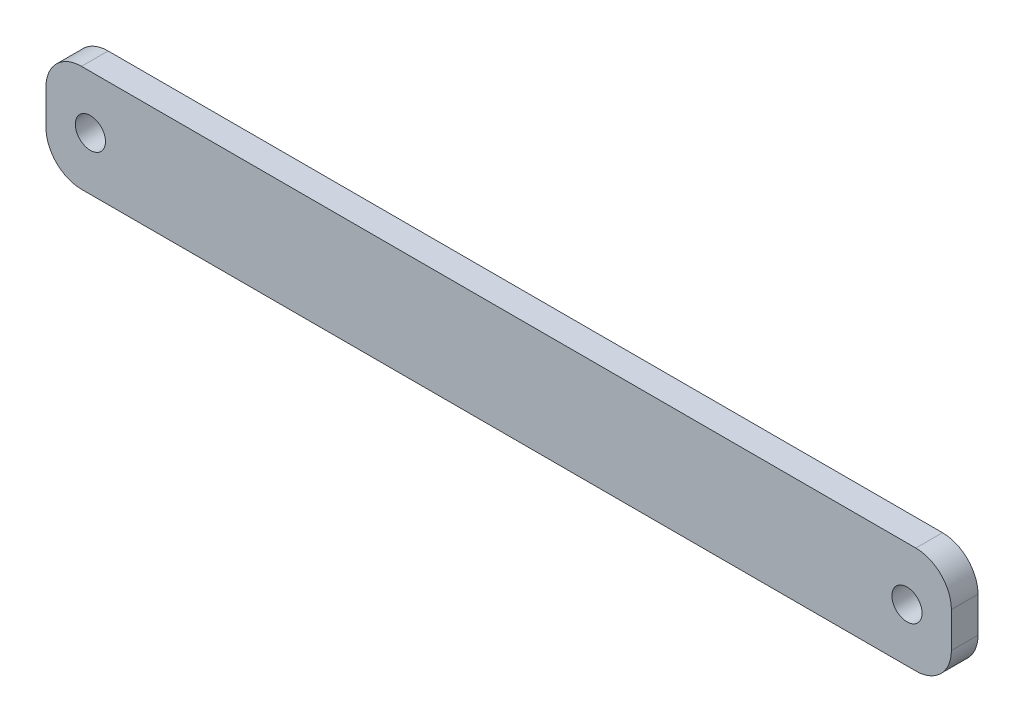
ISO-10303-21;
HEADER;
FILE_DESCRIPTION(('STEP AP214'),'2;1');
FILE_NAME('part.step','',(''),(''),'','','');
FILE_SCHEMA(('AUTOMOTIVE_DESIGN { 1 0 10303 214 1 1 1 1 }'));
ENDSEC;
DATA;
#1=APPLICATION_CONTEXT('core data for automotive mechanical design processes');
#2=APPLICATION_PROTOCOL_DEFINITION('international standard','automotive_design',2000,#1);
#3=PRODUCT_CONTEXT('',#1,'mechanical');
#4=PRODUCT('Part','Part','',(#3));
#5=PRODUCT_RELATED_PRODUCT_CATEGORY('part','',(#4));
#6=PRODUCT_DEFINITION_FORMATION('','',#4);
#7=PRODUCT_DEFINITION_CONTEXT('part definition',#1,'design');
#8=PRODUCT_DEFINITION('design','',#6,#7);
#9=PRODUCT_DEFINITION_SHAPE('','',#8);
#10=(LENGTH_UNIT() NAMED_UNIT(*) SI_UNIT(.MILLI.,.METRE.));
#11=(NAMED_UNIT(*) PLANE_ANGLE_UNIT() SI_UNIT($,.RADIAN.));
#12=(NAMED_UNIT(*) SI_UNIT($,.STERADIAN.) SOLID_ANGLE_UNIT());
#13=UNCERTAINTY_MEASURE_WITH_UNIT(LENGTH_MEASURE(1.E-05),#10,'distance_accuracy_value','');
#14=(GEOMETRIC_REPRESENTATION_CONTEXT(3) GLOBAL_UNCERTAINTY_ASSIGNED_CONTEXT((#13)) GLOBAL_UNIT_ASSIGNED_CONTEXT((#10,
#11,#12)) REPRESENTATION_CONTEXT('',''));
#15=CARTESIAN_POINT('',(0.,0.,0.));
#16=DIRECTION('',(0.,0.,1.));
#17=DIRECTION('',(1.,0.,0.));
#18=AXIS2_PLACEMENT_3D('',#15,#16,#17);
#19=CARTESIAN_POINT('',(-47.,-2.,3.));
#20=DIRECTION('',(0.,0.,-1.));
#21=DIRECTION('',(-1.,0.,0.));
#22=AXIS2_PLACEMENT_3D('',#19,#20,#21);
#23=CYLINDRICAL_SURFACE('',#22,4.);
#24=CARTESIAN_POINT('',(-47.,-2.,0.));
#25=DIRECTION('',(0.,0.,1.));
#26=DIRECTION('',(1.,0.,0.));
#27=AXIS2_PLACEMENT_3D('',#24,#25,#26);
#28=CIRCLE('',#27,4.);
#29=CARTESIAN_POINT('',(-51.,-2.,0.));
#30=VERTEX_POINT('',#29);
#31=CARTESIAN_POINT('',(-47.,-6.,0.));
#32=VERTEX_POINT('',#31);
#33=EDGE_CURVE('E132',#30,#32,#28,.T.);
#34=ORIENTED_EDGE('',*,*,#33,.T.);
#35=DIRECTION('',(0.,0.,-1.));
#36=VECTOR('',#35,1.);
#37=CARTESIAN_POINT('',(-47.,-6.,3.));
#38=LINE('',#37,#36);
#39=CARTESIAN_POINT('',(-47.,-6.,3.));
#40=VERTEX_POINT('',#39);
#41=EDGE_CURVE('E11',#40,#32,#38,.T.);
#42=ORIENTED_EDGE('',*,*,#41,.F.);
#43=CARTESIAN_POINT('',(-47.,-2.,3.));
#44=DIRECTION('',(0.,0.,1.));
#45=DIRECTION('',(1.,0.,0.));
#46=AXIS2_PLACEMENT_3D('',#43,#44,#45);
#47=CIRCLE('',#46,4.);
#48=CARTESIAN_POINT('',(-51.,-2.,3.));
#49=VERTEX_POINT('',#48);
#50=EDGE_CURVE('E147',#49,#40,#47,.T.);
#51=ORIENTED_EDGE('',*,*,#50,.F.);
#52=DIRECTION('',(0.,0.,-1.));
#53=VECTOR('',#52,1.);
#54=CARTESIAN_POINT('',(-51.,-2.,3.));
#55=LINE('',#54,#53);
#56=EDGE_CURVE('E128',#49,#30,#55,.T.);
#57=ORIENTED_EDGE('',*,*,#56,.T.);
#58=EDGE_LOOP('',(#34,#42,#51,#57));
#59=FACE_BOUND('',#58,.T.);
#60=ADVANCED_FACE('F36',(#59),#23,.T.);
#61=CARTESIAN_POINT('',(-47.,-6.,3.));
#62=DIRECTION('',(0.,1.,0.));
#63=DIRECTION('',(0.,0.,1.));
#64=AXIS2_PLACEMENT_3D('',#61,#62,#63);
#65=PLANE('',#64);
#66=DIRECTION('',(1.,0.,0.));
#67=VECTOR('',#66,1.);
#68=CARTESIAN_POINT('',(-47.,-6.,0.));
#69=LINE('',#68,#67);
#70=CARTESIAN_POINT('',(47.,-6.,0.));
#71=VERTEX_POINT('',#70);
#72=EDGE_CURVE('E135',#32,#71,#69,.T.);
#73=ORIENTED_EDGE('',*,*,#72,.T.);
#74=DIRECTION('',(0.,0.,-1.));
#75=VECTOR('',#74,1.);
#76=CARTESIAN_POINT('',(47.,-6.,3.));
#77=LINE('',#76,#75);
#78=CARTESIAN_POINT('',(47.,-6.,3.));
#79=VERTEX_POINT('',#78);
#80=EDGE_CURVE('E44',#79,#71,#77,.T.);
#81=ORIENTED_EDGE('',*,*,#80,.F.);
#82=DIRECTION('',(1.,0.,0.));
#83=VECTOR('',#82,1.);
#84=CARTESIAN_POINT('',(-47.,-6.,3.));
#85=LINE('',#84,#83);
#86=EDGE_CURVE('E95',#40,#79,#85,.T.);
#87=ORIENTED_EDGE('',*,*,#86,.F.);
#88=ORIENTED_EDGE('',*,*,#41,.T.);
#89=EDGE_LOOP('',(#73,#81,#87,#88));
#90=FACE_BOUND('',#89,.T.);
#91=ADVANCED_FACE('F216',(#90),#65,.F.);
#92=CARTESIAN_POINT('',(47.,-2.,3.));
#93=DIRECTION('',(0.,0.,-1.));
#94=DIRECTION('',(-1.,0.,0.));
#95=AXIS2_PLACEMENT_3D('',#92,#93,#94);
#96=CYLINDRICAL_SURFACE('',#95,4.);
#97=CARTESIAN_POINT('',(47.,-2.,0.));
#98=DIRECTION('',(0.,0.,1.));
#99=DIRECTION('',(1.,0.,0.));
#100=AXIS2_PLACEMENT_3D('',#97,#98,#99);
#101=CIRCLE('',#100,4.);
#102=CARTESIAN_POINT('',(51.,-2.,0.));
#103=VERTEX_POINT('',#102);
#104=EDGE_CURVE('E138',#71,#103,#101,.T.);
#105=ORIENTED_EDGE('',*,*,#104,.T.);
#106=DIRECTION('',(0.,0.,-1.));
#107=VECTOR('',#106,1.);
#108=CARTESIAN_POINT('',(51.,-2.,3.));
#109=LINE('',#108,#107);
#110=CARTESIAN_POINT('',(51.,-2.,3.));
#111=VERTEX_POINT('',#110);
#112=EDGE_CURVE('E154',#111,#103,#109,.T.);
#113=ORIENTED_EDGE('',*,*,#112,.F.);
#114=CARTESIAN_POINT('',(47.,-2.,3.));
#115=DIRECTION('',(0.,0.,1.));
#116=DIRECTION('',(1.,0.,0.));
#117=AXIS2_PLACEMENT_3D('',#114,#115,#116);
#118=CIRCLE('',#117,4.);
#119=EDGE_CURVE('E162',#79,#111,#118,.T.);
#120=ORIENTED_EDGE('',*,*,#119,.F.);
#121=ORIENTED_EDGE('',*,*,#80,.T.);
#122=EDGE_LOOP('',(#105,#113,#120,#121));
#123=FACE_BOUND('',#122,.T.);
#124=ADVANCED_FACE('F160',(#123),#96,.T.);
#125=CARTESIAN_POINT('',(51.,-2.,3.));
#126=DIRECTION('',(-1.,0.,0.));
#127=DIRECTION('',(0.,0.,1.));
#128=AXIS2_PLACEMENT_3D('',#125,#126,#127);
#129=PLANE('',#128);
#130=DIRECTION('',(0.,1.,0.));
#131=VECTOR('',#130,1.);
#132=CARTESIAN_POINT('',(51.,-2.,0.));
#133=LINE('',#132,#131);
#134=CARTESIAN_POINT('',(51.,2.,0.));
#135=VERTEX_POINT('',#134);
#136=EDGE_CURVE('E140',#103,#135,#133,.T.);
#137=ORIENTED_EDGE('',*,*,#136,.T.);
#138=DIRECTION('',(0.,0.,-1.));
#139=VECTOR('',#138,1.);
#140=CARTESIAN_POINT('',(51.,2.,3.));
#141=LINE('',#140,#139);
#142=CARTESIAN_POINT('',(51.,2.,3.));
#143=VERTEX_POINT('',#142);
#144=EDGE_CURVE('E151',#143,#135,#141,.T.);
#145=ORIENTED_EDGE('',*,*,#144,.F.);
#146=DIRECTION('',(0.,1.,0.));
#147=VECTOR('',#146,1.);
#148=CARTESIAN_POINT('',(51.,-2.,3.));
#149=LINE('',#148,#147);
#150=EDGE_CURVE('E174',#111,#143,#149,.T.);
#151=ORIENTED_EDGE('',*,*,#150,.F.);
#152=ORIENTED_EDGE('',*,*,#112,.T.);
#153=EDGE_LOOP('',(#137,#145,#151,#152));
#154=FACE_BOUND('',#153,.T.);
#155=ADVANCED_FACE('F170',(#154),#129,.F.);
#156=CARTESIAN_POINT('',(47.,2.,3.));
#157=DIRECTION('',(0.,0.,-1.));
#158=DIRECTION('',(-1.,0.,0.));
#159=AXIS2_PLACEMENT_3D('',#156,#157,#158);
#160=CYLINDRICAL_SURFACE('',#159,4.);
#161=CARTESIAN_POINT('',(47.,2.,0.));
#162=DIRECTION('',(0.,0.,1.));
#163=DIRECTION('',(1.,0.,0.));
#164=AXIS2_PLACEMENT_3D('',#161,#162,#163);
#165=CIRCLE('',#164,4.);
#166=CARTESIAN_POINT('',(47.,6.,0.));
#167=VERTEX_POINT('',#166);
#168=EDGE_CURVE('E142',#135,#167,#165,.T.);
#169=ORIENTED_EDGE('',*,*,#168,.T.);
#170=DIRECTION('',(0.,0.,-1.));
#171=VECTOR('',#170,1.);
#172=CARTESIAN_POINT('',(47.,6.,3.));
#173=LINE('',#172,#171);
#174=CARTESIAN_POINT('',(47.,6.,3.));
#175=VERTEX_POINT('',#174);
#176=EDGE_CURVE('E123',#175,#167,#173,.T.);
#177=ORIENTED_EDGE('',*,*,#176,.F.);
#178=CARTESIAN_POINT('',(47.,2.,3.));
#179=DIRECTION('',(0.,0.,1.));
#180=DIRECTION('',(1.,0.,0.));
#181=AXIS2_PLACEMENT_3D('',#178,#179,#180);
#182=CIRCLE('',#181,4.);
#183=EDGE_CURVE('E114',#143,#175,#182,.T.);
#184=ORIENTED_EDGE('',*,*,#183,.F.);
#185=ORIENTED_EDGE('',*,*,#144,.T.);
#186=EDGE_LOOP('',(#169,#177,#184,#185));
#187=FACE_BOUND('',#186,.T.);
#188=ADVANCED_FACE('F173',(#187),#160,.T.);
#189=CARTESIAN_POINT('',(47.,6.,3.));
#190=DIRECTION('',(0.,-1.,0.));
#191=DIRECTION('',(0.,0.,-1.));
#192=AXIS2_PLACEMENT_3D('',#189,#190,#191);
#193=PLANE('',#192);
#194=DIRECTION('',(-1.,0.,0.));
#195=VECTOR('',#194,1.);
#196=CARTESIAN_POINT('',(47.,6.,0.));
#197=LINE('',#196,#195);
#198=CARTESIAN_POINT('',(-47.,6.,0.));
#199=VERTEX_POINT('',#198);
#200=EDGE_CURVE('E122',#167,#199,#197,.T.);
#201=ORIENTED_EDGE('',*,*,#200,.T.);
#202=DIRECTION('',(0.,0.,-1.));
#203=VECTOR('',#202,1.);
#204=CARTESIAN_POINT('',(-47.,6.,3.));
#205=LINE('',#204,#203);
#206=CARTESIAN_POINT('',(-47.,6.,3.));
#207=VERTEX_POINT('',#206);
#208=EDGE_CURVE('E119',#207,#199,#205,.T.);
#209=ORIENTED_EDGE('',*,*,#208,.F.);
#210=DIRECTION('',(-1.,0.,0.));
#211=VECTOR('',#210,1.);
#212=CARTESIAN_POINT('',(47.,6.,3.));
#213=LINE('',#212,#211);
#214=EDGE_CURVE('E108',#175,#207,#213,.T.);
#215=ORIENTED_EDGE('',*,*,#214,.F.);
#216=ORIENTED_EDGE('',*,*,#176,.T.);
#217=EDGE_LOOP('',(#201,#209,#215,#216));
#218=FACE_BOUND('',#217,.T.);
#219=ADVANCED_FACE('F120',(#218),#193,.F.);
#220=CARTESIAN_POINT('',(-47.,2.,3.));
#221=DIRECTION('',(0.,0.,-1.));
#222=DIRECTION('',(-1.,0.,0.));
#223=AXIS2_PLACEMENT_3D('',#220,#221,#222);
#224=CYLINDRICAL_SURFACE('',#223,4.);
#225=CARTESIAN_POINT('',(-47.,2.,0.));
#226=DIRECTION('',(0.,0.,1.));
#227=DIRECTION('',(1.,0.,0.));
#228=AXIS2_PLACEMENT_3D('',#225,#226,#227);
#229=CIRCLE('',#228,4.);
#230=CARTESIAN_POINT('',(-51.,2.,0.));
#231=VERTEX_POINT('',#230);
#232=EDGE_CURVE('E81',#199,#231,#229,.T.);
#233=ORIENTED_EDGE('',*,*,#232,.T.);
#234=DIRECTION('',(0.,0.,-1.));
#235=VECTOR('',#234,1.);
#236=CARTESIAN_POINT('',(-51.,2.,3.));
#237=LINE('',#236,#235);
#238=CARTESIAN_POINT('',(-51.,2.,3.));
#239=VERTEX_POINT('',#238);
#240=EDGE_CURVE('E124',#239,#231,#237,.T.);
#241=ORIENTED_EDGE('',*,*,#240,.F.);
#242=CARTESIAN_POINT('',(-47.,2.,3.));
#243=DIRECTION('',(0.,0.,1.));
#244=DIRECTION('',(1.,0.,0.));
#245=AXIS2_PLACEMENT_3D('',#242,#243,#244);
#246=CIRCLE('',#245,4.);
#247=EDGE_CURVE('E112',#207,#239,#246,.T.);
#248=ORIENTED_EDGE('',*,*,#247,.F.);
#249=ORIENTED_EDGE('',*,*,#208,.T.);
#250=EDGE_LOOP('',(#233,#241,#248,#249));
#251=FACE_BOUND('',#250,.T.);
#252=ADVANCED_FACE('F126',(#251),#224,.T.);
#253=CARTESIAN_POINT('',(-51.,2.,3.));
#254=DIRECTION('',(1.,0.,0.));
#255=DIRECTION('',(0.,0.,-1.));
#256=AXIS2_PLACEMENT_3D('',#253,#254,#255);
#257=PLANE('',#256);
#258=DIRECTION('',(0.,-1.,0.));
#259=VECTOR('',#258,1.);
#260=CARTESIAN_POINT('',(-51.,2.,0.));
#261=LINE('',#260,#259);
#262=EDGE_CURVE('E87',#231,#30,#261,.T.);
#263=ORIENTED_EDGE('',*,*,#262,.T.);
#264=ORIENTED_EDGE('',*,*,#56,.F.);
#265=DIRECTION('',(0.,-1.,0.));
#266=VECTOR('',#265,1.);
#267=CARTESIAN_POINT('',(-51.,2.,3.));
#268=LINE('',#267,#266);
#269=EDGE_CURVE('E52',#239,#49,#268,.T.);
#270=ORIENTED_EDGE('',*,*,#269,.F.);
#271=ORIENTED_EDGE('',*,*,#240,.T.);
#272=EDGE_LOOP('',(#263,#264,#270,#271));
#273=FACE_BOUND('',#272,.T.);
#274=ADVANCED_FACE('F203',(#273),#257,.F.);
#275=CARTESIAN_POINT('',(-47.,-2.,3.));
#276=DIRECTION('',(0.,0.,1.));
#277=DIRECTION('',(1.,0.,0.));
#278=AXIS2_PLACEMENT_3D('',#275,#276,#277);
#279=PLANE('',#278);
#280=CARTESIAN_POINT('',(-46.,0.,3.));
#281=DIRECTION('',(0.,0.,1.));
#282=DIRECTION('',(1.,0.,0.));
#283=AXIS2_PLACEMENT_3D('',#280,#281,#282);
#284=CIRCLE('',#283,1.7);
#285=CARTESIAN_POINT('',(-44.3,0.,3.));
#286=VERTEX_POINT('',#285);
#287=EDGE_CURVE('E186',#286,#286,#284,.T.);
#288=ORIENTED_EDGE('',*,*,#287,.F.);
#289=EDGE_LOOP('',(#288));
#290=FACE_BOUND('',#289,.T.);
#291=CARTESIAN_POINT('',(46.,0.,3.));
#292=DIRECTION('',(0.,0.,1.));
#293=DIRECTION('',(1.,0.,0.));
#294=AXIS2_PLACEMENT_3D('',#291,#292,#293);
#295=CIRCLE('',#294,1.7);
#296=CARTESIAN_POINT('',(47.7,0.,3.));
#297=VERTEX_POINT('',#296);
#298=EDGE_CURVE('E183',#297,#297,#295,.T.);
#299=ORIENTED_EDGE('',*,*,#298,.F.);
#300=EDGE_LOOP('',(#299));
#301=FACE_BOUND('',#300,.T.);
#302=ORIENTED_EDGE('',*,*,#50,.T.);
#303=ORIENTED_EDGE('',*,*,#86,.T.);
#304=ORIENTED_EDGE('',*,*,#119,.T.);
#305=ORIENTED_EDGE('',*,*,#150,.T.);
#306=ORIENTED_EDGE('',*,*,#183,.T.);
#307=ORIENTED_EDGE('',*,*,#214,.T.);
#308=ORIENTED_EDGE('',*,*,#247,.T.);
#309=ORIENTED_EDGE('',*,*,#269,.T.);
#310=EDGE_LOOP('',(#302,#303,#304,#305,#306,#307,#308,#309));
#311=FACE_BOUND('',#310,.T.);
#312=ADVANCED_FACE('F110',(#290,#301,#311),#279,.T.);
#313=CARTESIAN_POINT('',(-47.,-2.,0.));
#314=DIRECTION('',(0.,0.,1.));
#315=DIRECTION('',(1.,0.,0.));
#316=AXIS2_PLACEMENT_3D('',#313,#314,#315);
#317=PLANE('',#316);
#318=CARTESIAN_POINT('',(-46.,0.,0.));
#319=DIRECTION('',(0.,0.,1.));
#320=DIRECTION('',(1.,0.,0.));
#321=AXIS2_PLACEMENT_3D('',#318,#319,#320);
#322=CIRCLE('',#321,1.7);
#323=CARTESIAN_POINT('',(-44.3,0.,0.));
#324=VERTEX_POINT('',#323);
#325=EDGE_CURVE('E136',#324,#324,#322,.T.);
#326=ORIENTED_EDGE('',*,*,#325,.T.);
#327=EDGE_LOOP('',(#326));
#328=FACE_BOUND('',#327,.T.);
#329=CARTESIAN_POINT('',(46.,0.,0.));
#330=DIRECTION('',(0.,0.,1.));
#331=DIRECTION('',(1.,0.,0.));
#332=AXIS2_PLACEMENT_3D('',#329,#330,#331);
#333=CIRCLE('',#332,1.7);
#334=CARTESIAN_POINT('',(47.7,0.,0.));
#335=VERTEX_POINT('',#334);
#336=EDGE_CURVE('E180',#335,#335,#333,.T.);
#337=ORIENTED_EDGE('',*,*,#336,.T.);
#338=EDGE_LOOP('',(#337));
#339=FACE_BOUND('',#338,.T.);
#340=ORIENTED_EDGE('',*,*,#33,.F.);
#341=ORIENTED_EDGE('',*,*,#262,.F.);
#342=ORIENTED_EDGE('',*,*,#232,.F.);
#343=ORIENTED_EDGE('',*,*,#200,.F.);
#344=ORIENTED_EDGE('',*,*,#168,.F.);
#345=ORIENTED_EDGE('',*,*,#136,.F.);
#346=ORIENTED_EDGE('',*,*,#104,.F.);
#347=ORIENTED_EDGE('',*,*,#72,.F.);
#348=EDGE_LOOP('',(#340,#341,#342,#343,#344,#345,#346,#347));
#349=FACE_BOUND('',#348,.T.);
#350=ADVANCED_FACE('F166',(#328,#339,#349),#317,.F.);
#351=CARTESIAN_POINT('',(46.,0.,0.));
#352=DIRECTION('',(0.,0.,1.));
#353=DIRECTION('',(1.,0.,0.));
#354=AXIS2_PLACEMENT_3D('',#351,#352,#353);
#355=CYLINDRICAL_SURFACE('',#354,1.7);
#356=ORIENTED_EDGE('',*,*,#336,.F.);
#357=EDGE_LOOP('',(#356));
#358=FACE_BOUND('',#357,.T.);
#359=ORIENTED_EDGE('',*,*,#298,.T.);
#360=EDGE_LOOP('',(#359));
#361=FACE_BOUND('',#360,.T.);
#362=ADVANCED_FACE('F197',(#358,#361),#355,.F.);
#363=CARTESIAN_POINT('',(-46.,0.,0.));
#364=DIRECTION('',(0.,0.,1.));
#365=DIRECTION('',(1.,0.,0.));
#366=AXIS2_PLACEMENT_3D('',#363,#364,#365);
#367=CYLINDRICAL_SURFACE('',#366,1.7);
#368=ORIENTED_EDGE('',*,*,#325,.F.);
#369=EDGE_LOOP('',(#368));
#370=FACE_BOUND('',#369,.T.);
#371=ORIENTED_EDGE('',*,*,#287,.T.);
#372=EDGE_LOOP('',(#371));
#373=FACE_BOUND('',#372,.T.);
#374=ADVANCED_FACE('F194',(#370,#373),#367,.F.);
#375=CLOSED_SHELL('',(#60,#91,#124,#155,#188,#219,#252,#274,#312,#350,#362,#374));
#376=MANIFOLD_SOLID_BREP('B2',#375);
#377=ADVANCED_BREP_SHAPE_REPRESENTATION('',(#18,#376),#14);
#378=SHAPE_DEFINITION_REPRESENTATION(#9,#377);
ENDSEC;
END-ISO-10303-21;
